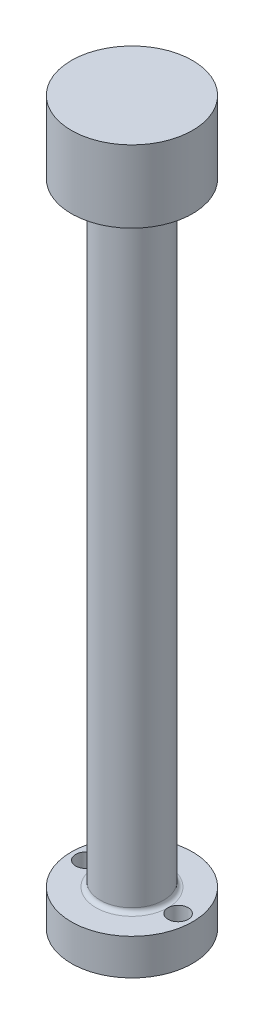
ISO-10303-21;
HEADER;
FILE_DESCRIPTION(('STEP AP214'),'2;1');
FILE_NAME('part.step','',(''),(''),'','','');
FILE_SCHEMA(('AUTOMOTIVE_DESIGN { 1 0 10303 214 1 1 1 1 }'));
ENDSEC;
DATA;
#1=APPLICATION_CONTEXT('core data for automotive mechanical design processes');
#2=APPLICATION_PROTOCOL_DEFINITION('international standard','automotive_design',2000,#1);
#3=PRODUCT_CONTEXT('',#1,'mechanical');
#4=PRODUCT('Part','Part','',(#3));
#5=PRODUCT_RELATED_PRODUCT_CATEGORY('part','',(#4));
#6=PRODUCT_DEFINITION_FORMATION('','',#4);
#7=PRODUCT_DEFINITION_CONTEXT('part definition',#1,'design');
#8=PRODUCT_DEFINITION('design','',#6,#7);
#9=PRODUCT_DEFINITION_SHAPE('','',#8);
#10=(LENGTH_UNIT() NAMED_UNIT(*) SI_UNIT(.MILLI.,.METRE.));
#11=(NAMED_UNIT(*) PLANE_ANGLE_UNIT() SI_UNIT($,.RADIAN.));
#12=(NAMED_UNIT(*) SI_UNIT($,.STERADIAN.) SOLID_ANGLE_UNIT());
#13=UNCERTAINTY_MEASURE_WITH_UNIT(LENGTH_MEASURE(1.E-05),#10,'distance_accuracy_value','');
#14=(GEOMETRIC_REPRESENTATION_CONTEXT(3) GLOBAL_UNCERTAINTY_ASSIGNED_CONTEXT((#13)) GLOBAL_UNIT_ASSIGNED_CONTEXT((#10,
#11,#12)) REPRESENTATION_CONTEXT('',''));
#15=CARTESIAN_POINT('',(0.,0.,0.));
#16=DIRECTION('',(0.,0.,1.));
#17=DIRECTION('',(1.,0.,0.));
#18=AXIS2_PLACEMENT_3D('',#15,#16,#17);
#19=CARTESIAN_POINT('',(0.,0.,0.));
#20=DIRECTION('',(0.,1.,0.));
#21=DIRECTION('',(-1.,0.,0.));
#22=AXIS2_PLACEMENT_3D('',#19,#20,#21);
#23=PLANE('',#22);
#24=CARTESIAN_POINT('',(-8.12800000000002,0.,0.));
#25=DIRECTION('',(0.,1.,0.));
#26=DIRECTION('',(-1.,0.,0.));
#27=AXIS2_PLACEMENT_3D('',#24,#25,#26);
#28=CIRCLE('',#27,1.778);
#29=CARTESIAN_POINT('',(-9.90600000000002,0.,0.));
#30=VERTEX_POINT('',#29);
#31=EDGE_CURVE('E74',#30,#30,#28,.F.);
#32=ORIENTED_EDGE('',*,*,#31,.F.);
#33=EDGE_LOOP('',(#32));
#34=FACE_BOUND('',#33,.T.);
#35=CARTESIAN_POINT('',(8.12800000000002,0.,0.));
#36=DIRECTION('',(0.,1.,0.));
#37=DIRECTION('',(-1.,0.,0.));
#38=AXIS2_PLACEMENT_3D('',#35,#36,#37);
#39=CIRCLE('',#38,1.778);
#40=CARTESIAN_POINT('',(6.35000000000002,0.,0.));
#41=VERTEX_POINT('',#40);
#42=EDGE_CURVE('E81',#41,#41,#39,.F.);
#43=ORIENTED_EDGE('',*,*,#42,.F.);
#44=EDGE_LOOP('',(#43));
#45=FACE_BOUND('',#44,.T.);
#46=CARTESIAN_POINT('',(0.,0.,0.));
#47=DIRECTION('',(0.,1.,0.));
#48=DIRECTION('',(-1.,0.,0.));
#49=AXIS2_PLACEMENT_3D('',#46,#47,#48);
#50=CIRCLE('',#49,10.668);
#51=CARTESIAN_POINT('',(-10.668,0.,0.));
#52=VERTEX_POINT('',#51);
#53=EDGE_CURVE('E98',#52,#52,#50,.T.);
#54=ORIENTED_EDGE('',*,*,#53,.F.);
#55=EDGE_LOOP('',(#54));
#56=FACE_BOUND('',#55,.T.);
#57=ADVANCED_FACE('F45',(#34,#45,#56),#23,.F.);
#58=CARTESIAN_POINT('',(0.,127.,0.));
#59=DIRECTION('',(0.,1.,0.));
#60=DIRECTION('',(-1.,0.,0.));
#61=AXIS2_PLACEMENT_3D('',#58,#59,#60);
#62=CYLINDRICAL_SURFACE('',#61,10.668);
#63=CARTESIAN_POINT('',(0.,6.34999999999999,0.));
#64=DIRECTION('',(0.,1.,0.));
#65=DIRECTION('',(-1.,0.,0.));
#66=AXIS2_PLACEMENT_3D('',#63,#64,#65);
#67=CIRCLE('',#66,10.668);
#68=CARTESIAN_POINT('',(-10.668,6.34999999999999,0.));
#69=VERTEX_POINT('',#68);
#70=EDGE_CURVE('E94',#69,#69,#67,.T.);
#71=ORIENTED_EDGE('',*,*,#70,.F.);
#72=EDGE_LOOP('',(#71));
#73=FACE_BOUND('',#72,.T.);
#74=ORIENTED_EDGE('',*,*,#53,.T.);
#75=EDGE_LOOP('',(#74));
#76=FACE_BOUND('',#75,.T.);
#77=ADVANCED_FACE('F125',(#73,#76),#62,.T.);
#78=CARTESIAN_POINT('',(10.668,6.35,0.));
#79=DIRECTION('',(0.,-1.,0.));
#80=DIRECTION('',(1.,0.,0.));
#81=AXIS2_PLACEMENT_3D('',#78,#79,#80);
#82=PLANE('',#81);
#83=CARTESIAN_POINT('',(-8.12800000000002,6.35,0.));
#84=DIRECTION('',(0.,1.,0.));
#85=DIRECTION('',(-1.,0.,0.));
#86=AXIS2_PLACEMENT_3D('',#83,#84,#85);
#87=CIRCLE('',#86,1.778);
#88=CARTESIAN_POINT('',(-6.35000000000002,6.35,0.));
#89=VERTEX_POINT('',#88);
#90=EDGE_CURVE('E66',#89,#89,#87,.T.);
#91=ORIENTED_EDGE('',*,*,#90,.F.);
#92=CARTESIAN_POINT('',(0.,6.35,0.));
#93=DIRECTION('',(0.,-1.,0.));
#94=DIRECTION('',(1.,0.,0.));
#95=AXIS2_PLACEMENT_3D('',#92,#93,#94);
#96=CIRCLE('',#95,6.35000000000001);
#97=CARTESIAN_POINT('',(6.35000000000002,6.35,0.));
#98=VERTEX_POINT('',#97);
#99=EDGE_CURVE('E11',#89,#98,#96,.T.);
#100=ORIENTED_EDGE('',*,*,#99,.T.);
#101=CARTESIAN_POINT('',(8.12800000000002,6.35,0.));
#102=DIRECTION('',(0.,1.,0.));
#103=DIRECTION('',(1.,0.,0.));
#104=AXIS2_PLACEMENT_3D('',#101,#102,#103);
#105=CIRCLE('',#104,1.778);
#106=EDGE_CURVE('E68',#98,#98,#105,.T.);
#107=ORIENTED_EDGE('',*,*,#106,.F.);
#108=CARTESIAN_POINT('',(0.,6.35,0.));
#109=DIRECTION('',(0.,-1.,0.));
#110=DIRECTION('',(1.,0.,0.));
#111=AXIS2_PLACEMENT_3D('',#108,#109,#110);
#112=CIRCLE('',#111,6.35000000000001);
#113=EDGE_CURVE('E54',#98,#89,#112,.T.);
#114=ORIENTED_EDGE('',*,*,#113,.T.);
#115=EDGE_LOOP('',(#91,#100,#107,#114));
#116=FACE_BOUND('',#115,.T.);
#117=ORIENTED_EDGE('',*,*,#70,.T.);
#118=EDGE_LOOP('',(#117));
#119=FACE_BOUND('',#118,.T.);
#120=ADVANCED_FACE('F64',(#116,#119),#82,.F.);
#121=CARTESIAN_POINT('',(0.,127.,0.));
#122=DIRECTION('',(0.,1.,0.));
#123=DIRECTION('',(-1.,0.,0.));
#124=AXIS2_PLACEMENT_3D('',#121,#122,#123);
#125=CYLINDRICAL_SURFACE('',#124,5.58800000000001);
#126=CARTESIAN_POINT('',(0.,7.11199999999999,0.));
#127=DIRECTION('',(0.,-1.,0.));
#128=DIRECTION('',(1.,0.,0.));
#129=AXIS2_PLACEMENT_3D('',#126,#127,#128);
#130=CIRCLE('',#129,5.58800000000001);
#131=CARTESIAN_POINT('',(5.58800000000001,7.11199999999999,0.));
#132=VERTEX_POINT('',#131);
#133=EDGE_CURVE('E70',#132,#132,#130,.F.);
#134=ORIENTED_EDGE('',*,*,#133,.T.);
#135=EDGE_LOOP('',(#134));
#136=FACE_BOUND('',#135,.T.);
#137=CARTESIAN_POINT('',(0.,113.03,0.));
#138=DIRECTION('',(0.,1.,0.));
#139=DIRECTION('',(-1.,0.,0.));
#140=AXIS2_PLACEMENT_3D('',#137,#138,#139);
#141=CIRCLE('',#140,5.58800000000001);
#142=CARTESIAN_POINT('',(-5.58800000000002,113.03,0.));
#143=VERTEX_POINT('',#142);
#144=EDGE_CURVE('E106',#143,#143,#141,.F.);
#145=ORIENTED_EDGE('',*,*,#144,.T.);
#146=EDGE_LOOP('',(#145));
#147=FACE_BOUND('',#146,.T.);
#148=ADVANCED_FACE('F114',(#136,#147),#125,.T.);
#149=CARTESIAN_POINT('',(5.588,114.3,0.));
#150=DIRECTION('',(0.,1.,0.));
#151=DIRECTION('',(-1.,0.,0.));
#152=AXIS2_PLACEMENT_3D('',#149,#150,#151);
#153=PLANE('',#152);
#154=CARTESIAN_POINT('',(0.,114.3,0.));
#155=DIRECTION('',(0.,1.,0.));
#156=DIRECTION('',(-1.,0.,0.));
#157=AXIS2_PLACEMENT_3D('',#154,#155,#156);
#158=CIRCLE('',#157,6.85800000000001);
#159=CARTESIAN_POINT('',(-6.85800000000002,114.3,0.));
#160=VERTEX_POINT('',#159);
#161=EDGE_CURVE('E102',#160,#160,#158,.T.);
#162=ORIENTED_EDGE('',*,*,#161,.T.);
#163=EDGE_LOOP('',(#162));
#164=FACE_BOUND('',#163,.T.);
#165=CARTESIAN_POINT('',(0.,114.3,0.));
#166=DIRECTION('',(0.,1.,0.));
#167=DIRECTION('',(-1.,0.,0.));
#168=AXIS2_PLACEMENT_3D('',#165,#166,#167);
#169=CIRCLE('',#168,10.668);
#170=CARTESIAN_POINT('',(-10.668,114.3,0.));
#171=VERTEX_POINT('',#170);
#172=EDGE_CURVE('E90',#171,#171,#169,.T.);
#173=ORIENTED_EDGE('',*,*,#172,.F.);
#174=EDGE_LOOP('',(#173));
#175=FACE_BOUND('',#174,.T.);
#176=ADVANCED_FACE('F142',(#164,#175),#153,.F.);
#177=CARTESIAN_POINT('',(0.,127.,0.));
#178=DIRECTION('',(0.,1.,0.));
#179=DIRECTION('',(-1.,0.,0.));
#180=AXIS2_PLACEMENT_3D('',#177,#178,#179);
#181=CYLINDRICAL_SURFACE('',#180,10.668);
#182=CARTESIAN_POINT('',(0.,127.,0.));
#183=DIRECTION('',(0.,1.,0.));
#184=DIRECTION('',(-1.,0.,0.));
#185=AXIS2_PLACEMENT_3D('',#182,#183,#184);
#186=CIRCLE('',#185,10.668);
#187=CARTESIAN_POINT('',(-10.668,127.,0.));
#188=VERTEX_POINT('',#187);
#189=EDGE_CURVE('E79',#188,#188,#186,.T.);
#190=ORIENTED_EDGE('',*,*,#189,.F.);
#191=EDGE_LOOP('',(#190));
#192=FACE_BOUND('',#191,.T.);
#193=ORIENTED_EDGE('',*,*,#172,.T.);
#194=EDGE_LOOP('',(#193));
#195=FACE_BOUND('',#194,.T.);
#196=ADVANCED_FACE('F144',(#192,#195),#181,.T.);
#197=CARTESIAN_POINT('',(10.668,127.,0.));
#198=DIRECTION('',(0.,-1.,0.));
#199=DIRECTION('',(1.,0.,0.));
#200=AXIS2_PLACEMENT_3D('',#197,#198,#199);
#201=PLANE('',#200);
#202=ORIENTED_EDGE('',*,*,#189,.T.);
#203=EDGE_LOOP('',(#202));
#204=FACE_BOUND('',#203,.T.);
#205=ADVANCED_FACE('F148',(#204),#201,.F.);
#206=CARTESIAN_POINT('',(8.12800000000002,-5.02894342779873,0.));
#207=DIRECTION('',(0.,1.,0.));
#208=DIRECTION('',(-1.,0.,0.));
#209=AXIS2_PLACEMENT_3D('',#206,#207,#208);
#210=CYLINDRICAL_SURFACE('',#209,1.778);
#211=ORIENTED_EDGE('',*,*,#42,.T.);
#212=EDGE_LOOP('',(#211));
#213=FACE_BOUND('',#212,.T.);
#214=ORIENTED_EDGE('',*,*,#106,.T.);
#215=EDGE_LOOP('',(#214));
#216=FACE_BOUND('',#215,.T.);
#217=ADVANCED_FACE('F151',(#213,#216),#210,.F.);
#218=CARTESIAN_POINT('',(-8.12800000000002,-5.02894342779872,0.));
#219=DIRECTION('',(0.,1.,0.));
#220=DIRECTION('',(-1.,0.,0.));
#221=AXIS2_PLACEMENT_3D('',#218,#219,#220);
#222=CYLINDRICAL_SURFACE('',#221,1.778);
#223=ORIENTED_EDGE('',*,*,#31,.T.);
#224=EDGE_LOOP('',(#223));
#225=FACE_BOUND('',#224,.T.);
#226=ORIENTED_EDGE('',*,*,#90,.T.);
#227=EDGE_LOOP('',(#226));
#228=FACE_BOUND('',#227,.T.);
#229=ADVANCED_FACE('F72',(#225,#228),#222,.F.);
#230=CARTESIAN_POINT('',(0.,113.03,0.));
#231=DIRECTION('',(0.,1.,0.));
#232=DIRECTION('',(-1.,0.,0.));
#233=AXIS2_PLACEMENT_3D('',#230,#231,#232);
#234=TOROIDAL_SURFACE('',#233,6.85800000000001,1.27);
#235=ORIENTED_EDGE('',*,*,#144,.F.);
#236=EDGE_LOOP('',(#235));
#237=FACE_BOUND('',#236,.T.);
#238=ORIENTED_EDGE('',*,*,#161,.F.);
#239=EDGE_LOOP('',(#238));
#240=FACE_BOUND('',#239,.T.);
#241=ADVANCED_FACE('F118',(#237,#240),#234,.F.);
#242=CARTESIAN_POINT('',(0.,7.11199999999999,0.));
#243=DIRECTION('',(0.,-1.,0.));
#244=DIRECTION('',(1.,0.,0.));
#245=AXIS2_PLACEMENT_3D('',#242,#243,#244);
#246=TOROIDAL_SURFACE('',#245,6.35000000000001,0.762);
#247=ORIENTED_EDGE('',*,*,#113,.F.);
#248=ORIENTED_EDGE('',*,*,#99,.F.);
#249=EDGE_LOOP('',(#247,#248));
#250=FACE_BOUND('',#249,.T.);
#251=ORIENTED_EDGE('',*,*,#133,.F.);
#252=EDGE_LOOP('',(#251));
#253=FACE_BOUND('',#252,.T.);
#254=ADVANCED_FACE('F47',(#250,#253),#246,.F.);
#255=CLOSED_SHELL('',(#57,#77,#120,#148,#176,#196,#205,#217,#229,#241,#254));
#256=MANIFOLD_SOLID_BREP('B2',#255);
#257=ADVANCED_BREP_SHAPE_REPRESENTATION('',(#18,#256),#14);
#258=SHAPE_DEFINITION_REPRESENTATION(#9,#257);
ENDSEC;
END-ISO-10303-21;
